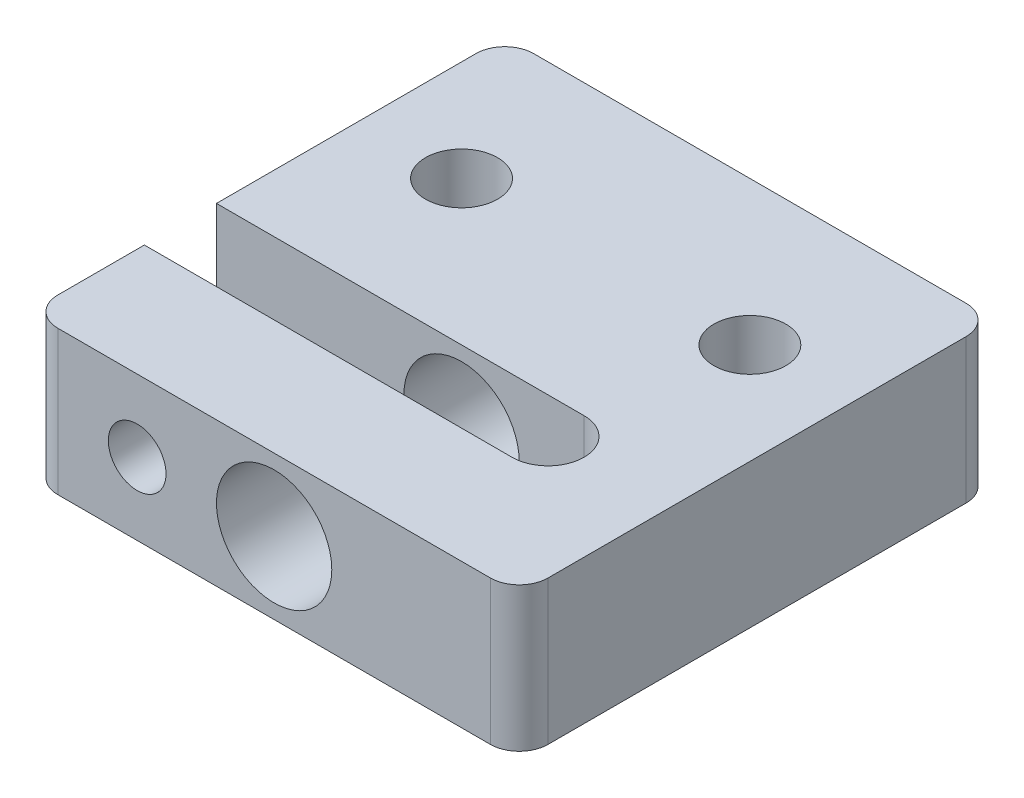
ISO-10303-21;
HEADER;
FILE_DESCRIPTION(('STEP AP214'),'2;1');
FILE_NAME('part.step','',(''),(''),'','','');
FILE_SCHEMA(('AUTOMOTIVE_DESIGN { 1 0 10303 214 1 1 1 1 }'));
ENDSEC;
DATA;
#1=APPLICATION_CONTEXT('core data for automotive mechanical design processes');
#2=APPLICATION_PROTOCOL_DEFINITION('international standard','automotive_design',2000,#1);
#3=PRODUCT_CONTEXT('',#1,'mechanical');
#4=PRODUCT('Part','Part','',(#3));
#5=PRODUCT_RELATED_PRODUCT_CATEGORY('part','',(#4));
#6=PRODUCT_DEFINITION_FORMATION('','',#4);
#7=PRODUCT_DEFINITION_CONTEXT('part definition',#1,'design');
#8=PRODUCT_DEFINITION('design','',#6,#7);
#9=PRODUCT_DEFINITION_SHAPE('','',#8);
#10=(LENGTH_UNIT() NAMED_UNIT(*) SI_UNIT(.MILLI.,.METRE.));
#11=(NAMED_UNIT(*) PLANE_ANGLE_UNIT() SI_UNIT($,.RADIAN.));
#12=(NAMED_UNIT(*) SI_UNIT($,.STERADIAN.) SOLID_ANGLE_UNIT());
#13=UNCERTAINTY_MEASURE_WITH_UNIT(LENGTH_MEASURE(1.E-05),#10,'distance_accuracy_value','');
#14=(GEOMETRIC_REPRESENTATION_CONTEXT(3) GLOBAL_UNCERTAINTY_ASSIGNED_CONTEXT((#13)) GLOBAL_UNIT_ASSIGNED_CONTEXT((#10,
#11,#12)) REPRESENTATION_CONTEXT('',''));
#15=CARTESIAN_POINT('',(0.,0.,0.));
#16=DIRECTION('',(0.,0.,1.));
#17=DIRECTION('',(1.,0.,0.));
#18=AXIS2_PLACEMENT_3D('',#15,#16,#17);
#19=CARTESIAN_POINT('',(25.5,0.,-10.5));
#20=DIRECTION('',(0.,-1.,0.));
#21=DIRECTION('',(0.,0.,-1.));
#22=AXIS2_PLACEMENT_3D('',#19,#20,#21);
#23=CYLINDRICAL_SURFACE('',#22,2.5);
#24=DIRECTION('',(0.,1.,0.));
#25=VECTOR('',#24,1.);
#26=CARTESIAN_POINT('',(25.5,0.,-8.));
#27=LINE('',#26,#25);
#28=CARTESIAN_POINT('',(25.5,10.,-8.));
#29=VERTEX_POINT('',#28);
#30=CARTESIAN_POINT('',(25.5,0.,-8.));
#31=VERTEX_POINT('',#30);
#32=EDGE_CURVE('E133',#29,#31,#27,.F.);
#33=ORIENTED_EDGE('',*,*,#32,.F.);
#34=CARTESIAN_POINT('',(25.5,10.,-10.5));
#35=DIRECTION('',(0.,-1.,0.));
#36=DIRECTION('',(0.,0.,-1.));
#37=AXIS2_PLACEMENT_3D('',#34,#35,#36);
#38=CIRCLE('',#37,2.5);
#39=CARTESIAN_POINT('',(28.,10.,-10.5));
#40=VERTEX_POINT('',#39);
#41=EDGE_CURVE('E11',#29,#40,#38,.F.);
#42=ORIENTED_EDGE('',*,*,#41,.T.);
#43=DIRECTION('',(0.,1.,0.));
#44=VECTOR('',#43,1.);
#45=CARTESIAN_POINT('',(28.,0.,-10.5));
#46=LINE('',#45,#44);
#47=CARTESIAN_POINT('',(28.,0.,-10.5));
#48=VERTEX_POINT('',#47);
#49=EDGE_CURVE('E214',#40,#48,#46,.F.);
#50=ORIENTED_EDGE('',*,*,#49,.T.);
#51=CARTESIAN_POINT('',(25.5,0.,-10.5));
#52=DIRECTION('',(0.,-1.,0.));
#53=DIRECTION('',(0.,0.,-1.));
#54=AXIS2_PLACEMENT_3D('',#51,#52,#53);
#55=CIRCLE('',#54,2.5);
#56=EDGE_CURVE('E43',#48,#31,#55,.T.);
#57=ORIENTED_EDGE('',*,*,#56,.T.);
#58=EDGE_LOOP('',(#33,#42,#50,#57));
#59=FACE_BOUND('',#58,.T.);
#60=ADVANCED_FACE('F35',(#59),#23,.F.);
#61=CARTESIAN_POINT('',(25.5,0.,-10.5));
#62=DIRECTION('',(0.,-1.,0.));
#63=DIRECTION('',(0.,0.,-1.));
#64=AXIS2_PLACEMENT_3D('',#61,#62,#63);
#65=CYLINDRICAL_SURFACE('',#64,2.5);
#66=DIRECTION('',(0.,1.,0.));
#67=VECTOR('',#66,1.);
#68=CARTESIAN_POINT('',(25.5,0.,-13.));
#69=LINE('',#68,#67);
#70=CARTESIAN_POINT('',(25.5,0.,-13.));
#71=VERTEX_POINT('',#70);
#72=CARTESIAN_POINT('',(25.5,10.,-13.));
#73=VERTEX_POINT('',#72);
#74=EDGE_CURVE('E211',#71,#73,#69,.T.);
#75=ORIENTED_EDGE('',*,*,#74,.F.);
#76=CARTESIAN_POINT('',(25.5,0.,-10.5));
#77=DIRECTION('',(0.,-1.,0.));
#78=DIRECTION('',(0.,0.,-1.));
#79=AXIS2_PLACEMENT_3D('',#76,#77,#78);
#80=CIRCLE('',#79,2.5);
#81=EDGE_CURVE('E216',#71,#48,#80,.T.);
#82=ORIENTED_EDGE('',*,*,#81,.T.);
#83=ORIENTED_EDGE('',*,*,#49,.F.);
#84=CARTESIAN_POINT('',(25.5,10.,-10.5));
#85=DIRECTION('',(0.,-1.,0.));
#86=DIRECTION('',(0.,0.,-1.));
#87=AXIS2_PLACEMENT_3D('',#84,#85,#86);
#88=CIRCLE('',#87,2.5);
#89=EDGE_CURVE('E219',#40,#73,#88,.F.);
#90=ORIENTED_EDGE('',*,*,#89,.T.);
#91=EDGE_LOOP('',(#75,#82,#83,#90));
#92=FACE_BOUND('',#91,.T.);
#93=ADVANCED_FACE('F285',(#92),#65,.F.);
#94=CARTESIAN_POINT('',(0.,10.,0.));
#95=DIRECTION('',(1.,0.,0.));
#96=DIRECTION('',(0.,0.,-1.));
#97=AXIS2_PLACEMENT_3D('',#94,#95,#96);
#98=PLANE('',#97);
#99=DIRECTION('',(0.,0.,1.));
#100=VECTOR('',#99,1.);
#101=CARTESIAN_POINT('',(0.,0.,0.));
#102=LINE('',#101,#100);
#103=CARTESIAN_POINT('',(0.,0.,-31.));
#104=VERTEX_POINT('',#103);
#105=CARTESIAN_POINT('',(0.,0.,-13.));
#106=VERTEX_POINT('',#105);
#107=EDGE_CURVE('E153',#104,#106,#102,.T.);
#108=ORIENTED_EDGE('',*,*,#107,.T.);
#109=DIRECTION('',(0.,1.,0.));
#110=VECTOR('',#109,1.);
#111=CARTESIAN_POINT('',(0.,0.,-13.));
#112=LINE('',#111,#110);
#113=CARTESIAN_POINT('',(0.,10.,-13.));
#114=VERTEX_POINT('',#113);
#115=EDGE_CURVE('E146',#106,#114,#112,.T.);
#116=ORIENTED_EDGE('',*,*,#115,.T.);
#117=DIRECTION('',(0.,0.,1.));
#118=VECTOR('',#117,1.);
#119=CARTESIAN_POINT('',(0.,10.,0.));
#120=LINE('',#119,#118);
#121=CARTESIAN_POINT('',(0.,10.,-31.));
#122=VERTEX_POINT('',#121);
#123=EDGE_CURVE('E255',#122,#114,#120,.T.);
#124=ORIENTED_EDGE('',*,*,#123,.F.);
#125=DIRECTION('',(0.,1.,0.));
#126=VECTOR('',#125,1.);
#127=CARTESIAN_POINT('',(0.,10.,-31.));
#128=LINE('',#127,#126);
#129=EDGE_CURVE('E196',#122,#104,#128,.F.);
#130=ORIENTED_EDGE('',*,*,#129,.T.);
#131=EDGE_LOOP('',(#108,#116,#124,#130));
#132=FACE_BOUND('',#131,.T.);
#133=ADVANCED_FACE('F276',(#132),#98,.F.);
#134=CARTESIAN_POINT('',(2.,10.,-2.));
#135=DIRECTION('',(0.,1.,0.));
#136=DIRECTION('',(0.,0.,1.));
#137=AXIS2_PLACEMENT_3D('',#134,#135,#136);
#138=CYLINDRICAL_SURFACE('',#137,2.);
#139=DIRECTION('',(0.,1.,0.));
#140=VECTOR('',#139,1.);
#141=CARTESIAN_POINT('',(0.,10.,-2.));
#142=LINE('',#141,#140);
#143=CARTESIAN_POINT('',(0.,0.,-2.));
#144=VERTEX_POINT('',#143);
#145=CARTESIAN_POINT('',(0.,10.,-2.));
#146=VERTEX_POINT('',#145);
#147=EDGE_CURVE('E203',#144,#146,#142,.T.);
#148=ORIENTED_EDGE('',*,*,#147,.F.);
#149=CARTESIAN_POINT('',(2.,0.,-2.));
#150=DIRECTION('',(0.,-1.,0.));
#151=DIRECTION('',(0.,0.,-1.));
#152=AXIS2_PLACEMENT_3D('',#149,#150,#151);
#153=CIRCLE('',#152,2.);
#154=CARTESIAN_POINT('',(2.,0.,0.));
#155=VERTEX_POINT('',#154);
#156=EDGE_CURVE('E151',#155,#144,#153,.T.);
#157=ORIENTED_EDGE('',*,*,#156,.F.);
#158=DIRECTION('',(0.,1.,0.));
#159=VECTOR('',#158,1.);
#160=CARTESIAN_POINT('',(2.,10.,0.));
#161=LINE('',#160,#159);
#162=CARTESIAN_POINT('',(2.,10.,0.));
#163=VERTEX_POINT('',#162);
#164=EDGE_CURVE('E205',#163,#155,#161,.F.);
#165=ORIENTED_EDGE('',*,*,#164,.F.);
#166=CARTESIAN_POINT('',(2.,10.,-2.));
#167=DIRECTION('',(0.,-1.,0.));
#168=DIRECTION('',(0.,0.,-1.));
#169=AXIS2_PLACEMENT_3D('',#166,#167,#168);
#170=CIRCLE('',#169,2.);
#171=EDGE_CURVE('E209',#146,#163,#170,.F.);
#172=ORIENTED_EDGE('',*,*,#171,.F.);
#173=EDGE_LOOP('',(#148,#157,#165,#172));
#174=FACE_BOUND('',#173,.T.);
#175=ADVANCED_FACE('F289',(#174),#138,.T.);
#176=CARTESIAN_POINT('',(2.,10.,-31.));
#177=DIRECTION('',(0.,1.,0.));
#178=DIRECTION('',(0.,0.,1.));
#179=AXIS2_PLACEMENT_3D('',#176,#177,#178);
#180=CYLINDRICAL_SURFACE('',#179,2.);
#181=DIRECTION('',(0.,1.,0.));
#182=VECTOR('',#181,1.);
#183=CARTESIAN_POINT('',(2.,10.,-33.));
#184=LINE('',#183,#182);
#185=CARTESIAN_POINT('',(2.,0.,-33.));
#186=VERTEX_POINT('',#185);
#187=CARTESIAN_POINT('',(2.,10.,-33.));
#188=VERTEX_POINT('',#187);
#189=EDGE_CURVE('E193',#186,#188,#184,.T.);
#190=ORIENTED_EDGE('',*,*,#189,.F.);
#191=CARTESIAN_POINT('',(2.,0.,-31.));
#192=DIRECTION('',(0.,-1.,0.));
#193=DIRECTION('',(0.,0.,-1.));
#194=AXIS2_PLACEMENT_3D('',#191,#192,#193);
#195=CIRCLE('',#194,2.);
#196=EDGE_CURVE('E199',#104,#186,#195,.T.);
#197=ORIENTED_EDGE('',*,*,#196,.F.);
#198=ORIENTED_EDGE('',*,*,#129,.F.);
#199=CARTESIAN_POINT('',(2.,10.,-31.));
#200=DIRECTION('',(0.,-1.,0.));
#201=DIRECTION('',(0.,0.,-1.));
#202=AXIS2_PLACEMENT_3D('',#199,#200,#201);
#203=CIRCLE('',#202,2.);
#204=EDGE_CURVE('E201',#188,#122,#203,.F.);
#205=ORIENTED_EDGE('',*,*,#204,.F.);
#206=EDGE_LOOP('',(#190,#197,#198,#205));
#207=FACE_BOUND('',#206,.T.);
#208=ADVANCED_FACE('F272',(#207),#180,.T.);
#209=CARTESIAN_POINT('',(32.,10.,-31.));
#210=DIRECTION('',(0.,1.,0.));
#211=DIRECTION('',(0.,0.,1.));
#212=AXIS2_PLACEMENT_3D('',#209,#210,#211);
#213=CYLINDRICAL_SURFACE('',#212,2.);
#214=DIRECTION('',(0.,1.,0.));
#215=VECTOR('',#214,1.);
#216=CARTESIAN_POINT('',(34.,10.,-31.));
#217=LINE('',#216,#215);
#218=CARTESIAN_POINT('',(34.,0.,-31.));
#219=VERTEX_POINT('',#218);
#220=CARTESIAN_POINT('',(34.,10.,-31.));
#221=VERTEX_POINT('',#220);
#222=EDGE_CURVE('E183',#219,#221,#217,.T.);
#223=ORIENTED_EDGE('',*,*,#222,.F.);
#224=CARTESIAN_POINT('',(32.,0.,-31.));
#225=DIRECTION('',(0.,-1.,0.));
#226=DIRECTION('',(0.,0.,-1.));
#227=AXIS2_PLACEMENT_3D('',#224,#225,#226);
#228=CIRCLE('',#227,2.);
#229=CARTESIAN_POINT('',(32.,0.,-33.));
#230=VERTEX_POINT('',#229);
#231=EDGE_CURVE('E189',#230,#219,#228,.T.);
#232=ORIENTED_EDGE('',*,*,#231,.F.);
#233=DIRECTION('',(0.,1.,0.));
#234=VECTOR('',#233,1.);
#235=CARTESIAN_POINT('',(32.,10.,-33.));
#236=LINE('',#235,#234);
#237=CARTESIAN_POINT('',(32.,10.,-33.));
#238=VERTEX_POINT('',#237);
#239=EDGE_CURVE('E186',#238,#230,#236,.F.);
#240=ORIENTED_EDGE('',*,*,#239,.F.);
#241=CARTESIAN_POINT('',(32.,10.,-31.));
#242=DIRECTION('',(0.,-1.,0.));
#243=DIRECTION('',(0.,0.,-1.));
#244=AXIS2_PLACEMENT_3D('',#241,#242,#243);
#245=CIRCLE('',#244,2.);
#246=EDGE_CURVE('E191',#221,#238,#245,.F.);
#247=ORIENTED_EDGE('',*,*,#246,.F.);
#248=EDGE_LOOP('',(#223,#232,#240,#247));
#249=FACE_BOUND('',#248,.T.);
#250=ADVANCED_FACE('F303',(#249),#213,.T.);
#251=CARTESIAN_POINT('',(32.,10.,-2.));
#252=DIRECTION('',(0.,1.,0.));
#253=DIRECTION('',(0.,0.,1.));
#254=AXIS2_PLACEMENT_3D('',#251,#252,#253);
#255=CYLINDRICAL_SURFACE('',#254,2.);
#256=DIRECTION('',(0.,1.,0.));
#257=VECTOR('',#256,1.);
#258=CARTESIAN_POINT('',(32.,10.,0.));
#259=LINE('',#258,#257);
#260=CARTESIAN_POINT('',(32.,0.,0.));
#261=VERTEX_POINT('',#260);
#262=CARTESIAN_POINT('',(32.,10.,0.));
#263=VERTEX_POINT('',#262);
#264=EDGE_CURVE('E172',#261,#263,#259,.T.);
#265=ORIENTED_EDGE('',*,*,#264,.F.);
#266=CARTESIAN_POINT('',(32.,0.,-2.));
#267=DIRECTION('',(0.,-1.,0.));
#268=DIRECTION('',(0.,0.,-1.));
#269=AXIS2_PLACEMENT_3D('',#266,#267,#268);
#270=CIRCLE('',#269,2.);
#271=CARTESIAN_POINT('',(34.,0.,-2.));
#272=VERTEX_POINT('',#271);
#273=EDGE_CURVE('E178',#272,#261,#270,.T.);
#274=ORIENTED_EDGE('',*,*,#273,.F.);
#275=DIRECTION('',(0.,1.,0.));
#276=VECTOR('',#275,1.);
#277=CARTESIAN_POINT('',(34.,10.,-2.));
#278=LINE('',#277,#276);
#279=CARTESIAN_POINT('',(34.,10.,-2.));
#280=VERTEX_POINT('',#279);
#281=EDGE_CURVE('E175',#280,#272,#278,.F.);
#282=ORIENTED_EDGE('',*,*,#281,.F.);
#283=CARTESIAN_POINT('',(32.,10.,-2.));
#284=DIRECTION('',(0.,-1.,0.));
#285=DIRECTION('',(0.,0.,-1.));
#286=AXIS2_PLACEMENT_3D('',#283,#284,#285);
#287=CIRCLE('',#286,2.);
#288=EDGE_CURVE('E181',#263,#280,#287,.F.);
#289=ORIENTED_EDGE('',*,*,#288,.F.);
#290=EDGE_LOOP('',(#265,#274,#282,#289));
#291=FACE_BOUND('',#290,.T.);
#292=ADVANCED_FACE('F297',(#291),#255,.T.);
#293=CARTESIAN_POINT('',(0.,10.,-8.));
#294=VERTEX_POINT('',#293);
#295=EDGE_CURVE('E145',#294,#146,#120,.T.);
#296=ORIENTED_EDGE('',*,*,#295,.F.);
#297=DIRECTION('',(0.,1.,0.));
#298=VECTOR('',#297,1.);
#299=CARTESIAN_POINT('',(0.,0.,-8.));
#300=LINE('',#299,#298);
#301=CARTESIAN_POINT('',(0.,0.,-8.));
#302=VERTEX_POINT('',#301);
#303=EDGE_CURVE('E132',#302,#294,#300,.T.);
#304=ORIENTED_EDGE('',*,*,#303,.F.);
#305=EDGE_CURVE('E143',#302,#144,#102,.T.);
#306=ORIENTED_EDGE('',*,*,#305,.T.);
#307=ORIENTED_EDGE('',*,*,#147,.T.);
#308=EDGE_LOOP('',(#296,#304,#306,#307));
#309=FACE_BOUND('',#308,.T.);
#310=ADVANCED_FACE('F141',(#309),#98,.F.);
#311=CARTESIAN_POINT('',(0.,10.,0.));
#312=DIRECTION('',(0.,0.,-1.));
#313=DIRECTION('',(-1.,0.,0.));
#314=AXIS2_PLACEMENT_3D('',#311,#312,#313);
#315=PLANE('',#314);
#316=CARTESIAN_POINT('',(7.5,5.,0.));
#317=DIRECTION('',(0.,0.,1.));
#318=DIRECTION('',(1.,0.,0.));
#319=AXIS2_PLACEMENT_3D('',#316,#317,#318);
#320=CIRCLE('',#319,2.);
#321=CARTESIAN_POINT('',(9.5,5.,0.));
#322=VERTEX_POINT('',#321);
#323=EDGE_CURVE('E236',#322,#322,#320,.T.);
#324=ORIENTED_EDGE('',*,*,#323,.F.);
#325=EDGE_LOOP('',(#324));
#326=FACE_BOUND('',#325,.T.);
#327=CARTESIAN_POINT('',(17.,5.,0.));
#328=DIRECTION('',(0.,0.,1.));
#329=DIRECTION('',(1.,0.,0.));
#330=AXIS2_PLACEMENT_3D('',#327,#328,#329);
#331=CIRCLE('',#330,4.);
#332=CARTESIAN_POINT('',(21.,5.,0.));
#333=VERTEX_POINT('',#332);
#334=EDGE_CURVE('E225',#333,#333,#331,.T.);
#335=ORIENTED_EDGE('',*,*,#334,.F.);
#336=EDGE_LOOP('',(#335));
#337=FACE_BOUND('',#336,.T.);
#338=DIRECTION('',(1.,0.,0.));
#339=VECTOR('',#338,1.);
#340=CARTESIAN_POINT('',(0.,10.,0.));
#341=LINE('',#340,#339);
#342=EDGE_CURVE('E258',#163,#263,#341,.T.);
#343=ORIENTED_EDGE('',*,*,#342,.F.);
#344=ORIENTED_EDGE('',*,*,#164,.T.);
#345=DIRECTION('',(1.,0.,0.));
#346=VECTOR('',#345,1.);
#347=CARTESIAN_POINT('',(0.,0.,0.));
#348=LINE('',#347,#346);
#349=EDGE_CURVE('E157',#155,#261,#348,.T.);
#350=ORIENTED_EDGE('',*,*,#349,.T.);
#351=ORIENTED_EDGE('',*,*,#264,.T.);
#352=EDGE_LOOP('',(#343,#344,#350,#351));
#353=FACE_BOUND('',#352,.T.);
#354=ADVANCED_FACE('F292',(#326,#337,#353),#315,.F.);
#355=CARTESIAN_POINT('',(34.,10.,0.));
#356=DIRECTION('',(-1.,0.,0.));
#357=DIRECTION('',(0.,0.,1.));
#358=AXIS2_PLACEMENT_3D('',#355,#356,#357);
#359=PLANE('',#358);
#360=DIRECTION('',(0.,0.,-1.));
#361=VECTOR('',#360,1.);
#362=CARTESIAN_POINT('',(34.,0.,0.));
#363=LINE('',#362,#361);
#364=EDGE_CURVE('E166',#272,#219,#363,.T.);
#365=ORIENTED_EDGE('',*,*,#364,.T.);
#366=ORIENTED_EDGE('',*,*,#222,.T.);
#367=DIRECTION('',(0.,0.,-1.));
#368=VECTOR('',#367,1.);
#369=CARTESIAN_POINT('',(34.,10.,0.));
#370=LINE('',#369,#368);
#371=EDGE_CURVE('E259',#280,#221,#370,.T.);
#372=ORIENTED_EDGE('',*,*,#371,.F.);
#373=ORIENTED_EDGE('',*,*,#281,.T.);
#374=EDGE_LOOP('',(#365,#366,#372,#373));
#375=FACE_BOUND('',#374,.T.);
#376=ADVANCED_FACE('F300',(#375),#359,.F.);
#377=CARTESIAN_POINT('',(0.,10.,-33.));
#378=DIRECTION('',(0.,0.,1.));
#379=DIRECTION('',(1.,0.,0.));
#380=AXIS2_PLACEMENT_3D('',#377,#378,#379);
#381=PLANE('',#380);
#382=CARTESIAN_POINT('',(17.,5.,-33.));
#383=DIRECTION('',(0.,0.,1.));
#384=DIRECTION('',(1.,0.,0.));
#385=AXIS2_PLACEMENT_3D('',#382,#383,#384);
#386=CIRCLE('',#385,4.);
#387=CARTESIAN_POINT('',(21.,5.,-33.));
#388=VERTEX_POINT('',#387);
#389=EDGE_CURVE('E229',#388,#388,#386,.T.);
#390=ORIENTED_EDGE('',*,*,#389,.T.);
#391=EDGE_LOOP('',(#390));
#392=FACE_BOUND('',#391,.T.);
#393=DIRECTION('',(-1.,0.,0.));
#394=VECTOR('',#393,1.);
#395=CARTESIAN_POINT('',(0.,0.,-33.));
#396=LINE('',#395,#394);
#397=EDGE_CURVE('E169',#230,#186,#396,.T.);
#398=ORIENTED_EDGE('',*,*,#397,.T.);
#399=ORIENTED_EDGE('',*,*,#189,.T.);
#400=DIRECTION('',(-1.,0.,0.));
#401=VECTOR('',#400,1.);
#402=CARTESIAN_POINT('',(0.,10.,-33.));
#403=LINE('',#402,#401);
#404=EDGE_CURVE('E163',#238,#188,#403,.T.);
#405=ORIENTED_EDGE('',*,*,#404,.F.);
#406=ORIENTED_EDGE('',*,*,#239,.T.);
#407=EDGE_LOOP('',(#398,#399,#405,#406));
#408=FACE_BOUND('',#407,.T.);
#409=ADVANCED_FACE('F268',(#392,#408),#381,.F.);
#410=CARTESIAN_POINT('',(0.,10.,0.));
#411=DIRECTION('',(0.,-1.,0.));
#412=DIRECTION('',(0.,0.,-1.));
#413=AXIS2_PLACEMENT_3D('',#410,#411,#412);
#414=PLANE('',#413);
#415=CARTESIAN_POINT('',(27.,10.,-23.));
#416=DIRECTION('',(0.,1.,0.));
#417=DIRECTION('',(0.,0.,1.));
#418=AXIS2_PLACEMENT_3D('',#415,#416,#417);
#419=CIRCLE('',#418,2.5);
#420=CARTESIAN_POINT('',(27.,10.,-20.5));
#421=VERTEX_POINT('',#420);
#422=EDGE_CURVE('E246',#421,#421,#419,.T.);
#423=ORIENTED_EDGE('',*,*,#422,.F.);
#424=EDGE_LOOP('',(#423));
#425=FACE_BOUND('',#424,.T.);
#426=CARTESIAN_POINT('',(7.,10.,-23.));
#427=DIRECTION('',(0.,1.,0.));
#428=DIRECTION('',(0.,0.,1.));
#429=AXIS2_PLACEMENT_3D('',#426,#427,#428);
#430=CIRCLE('',#429,2.5);
#431=CARTESIAN_POINT('',(7.,10.,-20.5));
#432=VERTEX_POINT('',#431);
#433=EDGE_CURVE('E159',#432,#432,#430,.T.);
#434=ORIENTED_EDGE('',*,*,#433,.F.);
#435=EDGE_LOOP('',(#434));
#436=FACE_BOUND('',#435,.T.);
#437=ORIENTED_EDGE('',*,*,#123,.T.);
#438=DIRECTION('',(-1.,0.,0.));
#439=VECTOR('',#438,1.);
#440=CARTESIAN_POINT('',(0.,10.,-13.));
#441=LINE('',#440,#439);
#442=EDGE_CURVE('E137',#73,#114,#441,.T.);
#443=ORIENTED_EDGE('',*,*,#442,.F.);
#444=ORIENTED_EDGE('',*,*,#89,.F.);
#445=ORIENTED_EDGE('',*,*,#41,.F.);
#446=DIRECTION('',(1.,0.,0.));
#447=VECTOR('',#446,1.);
#448=CARTESIAN_POINT('',(0.,10.,-8.));
#449=LINE('',#448,#447);
#450=EDGE_CURVE('E240',#294,#29,#449,.T.);
#451=ORIENTED_EDGE('',*,*,#450,.F.);
#452=ORIENTED_EDGE('',*,*,#295,.T.);
#453=ORIENTED_EDGE('',*,*,#171,.T.);
#454=ORIENTED_EDGE('',*,*,#342,.T.);
#455=ORIENTED_EDGE('',*,*,#288,.T.);
#456=ORIENTED_EDGE('',*,*,#371,.T.);
#457=ORIENTED_EDGE('',*,*,#246,.T.);
#458=ORIENTED_EDGE('',*,*,#404,.T.);
#459=ORIENTED_EDGE('',*,*,#204,.T.);
#460=EDGE_LOOP('',(#437,#443,#444,#445,#451,#452,#453,#454,#455,#456,#457,#458,#459));
#461=FACE_BOUND('',#460,.T.);
#462=ADVANCED_FACE('F264',(#425,#436,#461),#414,.F.);
#463=CARTESIAN_POINT('',(0.,0.,0.));
#464=DIRECTION('',(0.,-1.,0.));
#465=DIRECTION('',(0.,0.,-1.));
#466=AXIS2_PLACEMENT_3D('',#463,#464,#465);
#467=PLANE('',#466);
#468=ORIENTED_EDGE('',*,*,#56,.F.);
#469=ORIENTED_EDGE('',*,*,#81,.F.);
#470=DIRECTION('',(-1.,0.,0.));
#471=VECTOR('',#470,1.);
#472=CARTESIAN_POINT('',(0.,0.,-13.));
#473=LINE('',#472,#471);
#474=EDGE_CURVE('E136',#71,#106,#473,.T.);
#475=ORIENTED_EDGE('',*,*,#474,.T.);
#476=ORIENTED_EDGE('',*,*,#107,.F.);
#477=ORIENTED_EDGE('',*,*,#196,.T.);
#478=ORIENTED_EDGE('',*,*,#397,.F.);
#479=ORIENTED_EDGE('',*,*,#231,.T.);
#480=ORIENTED_EDGE('',*,*,#364,.F.);
#481=ORIENTED_EDGE('',*,*,#273,.T.);
#482=ORIENTED_EDGE('',*,*,#349,.F.);
#483=ORIENTED_EDGE('',*,*,#156,.T.);
#484=ORIENTED_EDGE('',*,*,#305,.F.);
#485=DIRECTION('',(1.,0.,0.));
#486=VECTOR('',#485,1.);
#487=CARTESIAN_POINT('',(0.,0.,-8.));
#488=LINE('',#487,#486);
#489=EDGE_CURVE('E128',#302,#31,#488,.T.);
#490=ORIENTED_EDGE('',*,*,#489,.T.);
#491=EDGE_LOOP('',(#468,#469,#475,#476,#477,#478,#479,#480,#481,#482,#483,#484,#490));
#492=FACE_BOUND('',#491,.T.);
#493=CARTESIAN_POINT('',(27.,0.,-23.));
#494=DIRECTION('',(0.,1.,0.));
#495=DIRECTION('',(0.,0.,1.));
#496=AXIS2_PLACEMENT_3D('',#493,#494,#495);
#497=CIRCLE('',#496,2.5);
#498=CARTESIAN_POINT('',(27.,0.,-20.5));
#499=VERTEX_POINT('',#498);
#500=EDGE_CURVE('E248',#499,#499,#497,.T.);
#501=ORIENTED_EDGE('',*,*,#500,.T.);
#502=EDGE_LOOP('',(#501));
#503=FACE_BOUND('',#502,.T.);
#504=CARTESIAN_POINT('',(7.,0.,-23.));
#505=DIRECTION('',(0.,1.,0.));
#506=DIRECTION('',(0.,0.,1.));
#507=AXIS2_PLACEMENT_3D('',#504,#505,#506);
#508=CIRCLE('',#507,2.5);
#509=CARTESIAN_POINT('',(7.,0.,-20.5));
#510=VERTEX_POINT('',#509);
#511=EDGE_CURVE('E154',#510,#510,#508,.T.);
#512=ORIENTED_EDGE('',*,*,#511,.T.);
#513=EDGE_LOOP('',(#512));
#514=FACE_BOUND('',#513,.T.);
#515=ADVANCED_FACE('F148',(#492,#503,#514),#467,.T.);
#516=CARTESIAN_POINT('',(7.,0.,-23.));
#517=DIRECTION('',(0.,1.,0.));
#518=DIRECTION('',(0.,0.,1.));
#519=AXIS2_PLACEMENT_3D('',#516,#517,#518);
#520=CYLINDRICAL_SURFACE('',#519,2.5);
#521=ORIENTED_EDGE('',*,*,#511,.F.);
#522=EDGE_LOOP('',(#521));
#523=FACE_BOUND('',#522,.T.);
#524=ORIENTED_EDGE('',*,*,#433,.T.);
#525=EDGE_LOOP('',(#524));
#526=FACE_BOUND('',#525,.T.);
#527=ADVANCED_FACE('F429',(#523,#526),#520,.F.);
#528=CARTESIAN_POINT('',(27.,0.,-23.));
#529=DIRECTION('',(0.,1.,0.));
#530=DIRECTION('',(0.,0.,1.));
#531=AXIS2_PLACEMENT_3D('',#528,#529,#530);
#532=CYLINDRICAL_SURFACE('',#531,2.5);
#533=ORIENTED_EDGE('',*,*,#500,.F.);
#534=EDGE_LOOP('',(#533));
#535=FACE_BOUND('',#534,.T.);
#536=ORIENTED_EDGE('',*,*,#422,.T.);
#537=EDGE_LOOP('',(#536));
#538=FACE_BOUND('',#537,.T.);
#539=ADVANCED_FACE('F413',(#535,#538),#532,.F.);
#540=CARTESIAN_POINT('',(0.,0.,-13.));
#541=DIRECTION('',(0.,0.,-1.));
#542=DIRECTION('',(-1.,0.,0.));
#543=AXIS2_PLACEMENT_3D('',#540,#541,#542);
#544=PLANE('',#543);
#545=CARTESIAN_POINT('',(17.,5.,-13.));
#546=DIRECTION('',(0.,0.,-1.));
#547=DIRECTION('',(-1.,0.,0.));
#548=AXIS2_PLACEMENT_3D('',#545,#546,#547);
#549=CIRCLE('',#548,4.);
#550=CARTESIAN_POINT('',(13.,5.,-13.));
#551=VERTEX_POINT('',#550);
#552=EDGE_CURVE('E224',#551,#551,#549,.T.);
#553=ORIENTED_EDGE('',*,*,#552,.T.);
#554=EDGE_LOOP('',(#553));
#555=FACE_BOUND('',#554,.T.);
#556=ORIENTED_EDGE('',*,*,#474,.F.);
#557=ORIENTED_EDGE('',*,*,#74,.T.);
#558=ORIENTED_EDGE('',*,*,#442,.T.);
#559=ORIENTED_EDGE('',*,*,#115,.F.);
#560=EDGE_LOOP('',(#556,#557,#558,#559));
#561=FACE_BOUND('',#560,.T.);
#562=ADVANCED_FACE('F282',(#555,#561),#544,.F.);
#563=CARTESIAN_POINT('',(0.,0.,-8.));
#564=DIRECTION('',(0.,0.,1.));
#565=DIRECTION('',(1.,0.,0.));
#566=AXIS2_PLACEMENT_3D('',#563,#564,#565);
#567=PLANE('',#566);
#568=CARTESIAN_POINT('',(7.5,5.,-8.));
#569=DIRECTION('',(0.,0.,1.));
#570=DIRECTION('',(1.,0.,0.));
#571=AXIS2_PLACEMENT_3D('',#568,#569,#570);
#572=CIRCLE('',#571,2.);
#573=CARTESIAN_POINT('',(9.5,5.,-8.));
#574=VERTEX_POINT('',#573);
#575=EDGE_CURVE('E38',#574,#574,#572,.T.);
#576=ORIENTED_EDGE('',*,*,#575,.T.);
#577=EDGE_LOOP('',(#576));
#578=FACE_BOUND('',#577,.T.);
#579=CARTESIAN_POINT('',(17.,5.,-8.));
#580=DIRECTION('',(0.,0.,1.));
#581=DIRECTION('',(1.,0.,0.));
#582=AXIS2_PLACEMENT_3D('',#579,#580,#581);
#583=CIRCLE('',#582,4.);
#584=CARTESIAN_POINT('',(21.,5.,-8.));
#585=VERTEX_POINT('',#584);
#586=EDGE_CURVE('E222',#585,#585,#583,.T.);
#587=ORIENTED_EDGE('',*,*,#586,.T.);
#588=EDGE_LOOP('',(#587));
#589=FACE_BOUND('',#588,.T.);
#590=ORIENTED_EDGE('',*,*,#450,.T.);
#591=ORIENTED_EDGE('',*,*,#32,.T.);
#592=ORIENTED_EDGE('',*,*,#489,.F.);
#593=ORIENTED_EDGE('',*,*,#303,.T.);
#594=EDGE_LOOP('',(#590,#591,#592,#593));
#595=FACE_BOUND('',#594,.T.);
#596=ADVANCED_FACE('F131',(#578,#589,#595),#567,.F.);
#597=CARTESIAN_POINT('',(17.,5.,-60.));
#598=DIRECTION('',(0.,0.,1.));
#599=DIRECTION('',(1.,0.,0.));
#600=AXIS2_PLACEMENT_3D('',#597,#598,#599);
#601=CYLINDRICAL_SURFACE('',#600,4.);
#602=ORIENTED_EDGE('',*,*,#334,.T.);
#603=EDGE_LOOP('',(#602));
#604=FACE_BOUND('',#603,.T.);
#605=ORIENTED_EDGE('',*,*,#586,.F.);
#606=EDGE_LOOP('',(#605));
#607=FACE_BOUND('',#606,.T.);
#608=ADVANCED_FACE('F383',(#604,#607),#601,.F.);
#609=ORIENTED_EDGE('',*,*,#552,.F.);
#610=EDGE_LOOP('',(#609));
#611=FACE_BOUND('',#610,.T.);
#612=ORIENTED_EDGE('',*,*,#389,.F.);
#613=EDGE_LOOP('',(#612));
#614=FACE_BOUND('',#613,.T.);
#615=ADVANCED_FACE('F374',(#611,#614),#601,.F.);
#616=CARTESIAN_POINT('',(7.5,5.,-10.));
#617=DIRECTION('',(0.,0.,1.));
#618=DIRECTION('',(1.,0.,0.));
#619=AXIS2_PLACEMENT_3D('',#616,#617,#618);
#620=CYLINDRICAL_SURFACE('',#619,2.);
#621=ORIENTED_EDGE('',*,*,#323,.T.);
#622=EDGE_LOOP('',(#621));
#623=FACE_BOUND('',#622,.T.);
#624=ORIENTED_EDGE('',*,*,#575,.F.);
#625=EDGE_LOOP('',(#624));
#626=FACE_BOUND('',#625,.T.);
#627=ADVANCED_FACE('F392',(#623,#626),#620,.F.);
#628=CLOSED_SHELL('',(#60,#93,#133,#175,#208,#250,#292,#310,#354,#376,#409,#462,#515,#527,#539,
#562,#596,#608,#615,#627));
#629=MANIFOLD_SOLID_BREP('B2',#628);
#630=ADVANCED_BREP_SHAPE_REPRESENTATION('',(#18,#629),#14);
#631=SHAPE_DEFINITION_REPRESENTATION(#9,#630);
ENDSEC;
END-ISO-10303-21;
